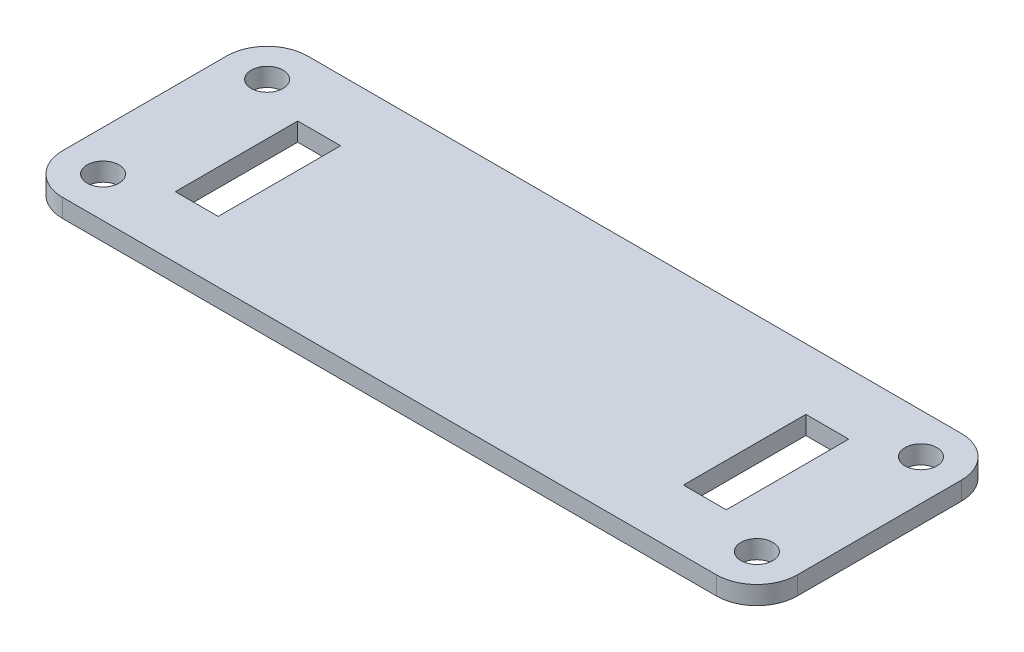
ISO-10303-21;
HEADER;
FILE_DESCRIPTION(('STEP AP214'),'2;1');
FILE_NAME('part.step','',(''),(''),'','','');
FILE_SCHEMA(('AUTOMOTIVE_DESIGN { 1 0 10303 214 1 1 1 1 }'));
ENDSEC;
DATA;
#1=APPLICATION_CONTEXT('core data for automotive mechanical design processes');
#2=APPLICATION_PROTOCOL_DEFINITION('international standard','automotive_design',2000,#1);
#3=PRODUCT_CONTEXT('',#1,'mechanical');
#4=PRODUCT('Part','Part','',(#3));
#5=PRODUCT_RELATED_PRODUCT_CATEGORY('part','',(#4));
#6=PRODUCT_DEFINITION_FORMATION('','',#4);
#7=PRODUCT_DEFINITION_CONTEXT('part definition',#1,'design');
#8=PRODUCT_DEFINITION('design','',#6,#7);
#9=PRODUCT_DEFINITION_SHAPE('','',#8);
#10=(LENGTH_UNIT() NAMED_UNIT(*) SI_UNIT(.MILLI.,.METRE.));
#11=(NAMED_UNIT(*) PLANE_ANGLE_UNIT() SI_UNIT($,.RADIAN.));
#12=(NAMED_UNIT(*) SI_UNIT($,.STERADIAN.) SOLID_ANGLE_UNIT());
#13=UNCERTAINTY_MEASURE_WITH_UNIT(LENGTH_MEASURE(1.E-05),#10,'distance_accuracy_value','');
#14=(GEOMETRIC_REPRESENTATION_CONTEXT(3) GLOBAL_UNCERTAINTY_ASSIGNED_CONTEXT((#13)) GLOBAL_UNIT_ASSIGNED_CONTEXT((#10,
#11,#12)) REPRESENTATION_CONTEXT('',''));
#15=CARTESIAN_POINT('',(0.,0.,0.));
#16=DIRECTION('',(0.,0.,1.));
#17=DIRECTION('',(1.,0.,0.));
#18=AXIS2_PLACEMENT_3D('',#15,#16,#17);
#19=CARTESIAN_POINT('',(-53.4,1.5,-13.4));
#20=DIRECTION('',(0.,1.,0.));
#21=DIRECTION('',(0.,0.,1.));
#22=AXIS2_PLACEMENT_3D('',#19,#20,#21);
#23=PLANE('',#22);
#24=DIRECTION('',(0.,0.,1.));
#25=VECTOR('',#24,1.);
#26=CARTESIAN_POINT('',(-45.,1.5,-10.));
#27=LINE('',#26,#25);
#28=CARTESIAN_POINT('',(-45.,1.5,-10.));
#29=VERTEX_POINT('',#28);
#30=CARTESIAN_POINT('',(-45.,1.5,10.));
#31=VERTEX_POINT('',#30);
#32=EDGE_CURVE('E54',#29,#31,#27,.T.);
#33=ORIENTED_EDGE('',*,*,#32,.F.);
#34=DIRECTION('',(-1.,0.,0.));
#35=VECTOR('',#34,1.);
#36=CARTESIAN_POINT('',(-45.,1.5,-10.));
#37=LINE('',#36,#35);
#38=CARTESIAN_POINT('',(-38.,1.5,-10.));
#39=VERTEX_POINT('',#38);
#40=EDGE_CURVE('E173',#39,#29,#37,.T.);
#41=ORIENTED_EDGE('',*,*,#40,.F.);
#42=DIRECTION('',(0.,0.,-1.));
#43=VECTOR('',#42,1.);
#44=CARTESIAN_POINT('',(-38.,1.5,-10.));
#45=LINE('',#44,#43);
#46=CARTESIAN_POINT('',(-38.,1.5,10.));
#47=VERTEX_POINT('',#46);
#48=EDGE_CURVE('E176',#47,#39,#45,.T.);
#49=ORIENTED_EDGE('',*,*,#48,.F.);
#50=DIRECTION('',(1.,0.,0.));
#51=VECTOR('',#50,1.);
#52=CARTESIAN_POINT('',(-45.,1.5,10.));
#53=LINE('',#52,#51);
#54=EDGE_CURVE('E182',#31,#47,#53,.T.);
#55=ORIENTED_EDGE('',*,*,#54,.F.);
#56=EDGE_LOOP('',(#33,#41,#49,#55));
#57=FACE_BOUND('',#56,.T.);
#58=DIRECTION('',(-1.,0.,0.));
#59=VECTOR('',#58,1.);
#60=CARTESIAN_POINT('',(45.,1.5,-10.));
#61=LINE('',#60,#59);
#62=CARTESIAN_POINT('',(45.,1.5,-10.));
#63=VERTEX_POINT('',#62);
#64=CARTESIAN_POINT('',(38.,1.5,-10.));
#65=VERTEX_POINT('',#64);
#66=EDGE_CURVE('E62',#63,#65,#61,.T.);
#67=ORIENTED_EDGE('',*,*,#66,.F.);
#68=DIRECTION('',(0.,0.,-1.));
#69=VECTOR('',#68,1.);
#70=CARTESIAN_POINT('',(45.,1.5,-10.));
#71=LINE('',#70,#69);
#72=CARTESIAN_POINT('',(45.,1.5,9.99999999999999));
#73=VERTEX_POINT('',#72);
#74=EDGE_CURVE('E201',#73,#63,#71,.T.);
#75=ORIENTED_EDGE('',*,*,#74,.F.);
#76=DIRECTION('',(1.,0.,0.));
#77=VECTOR('',#76,1.);
#78=CARTESIAN_POINT('',(45.,1.5,9.99999999999999));
#79=LINE('',#78,#77);
#80=CARTESIAN_POINT('',(38.,1.5,9.99999999999999));
#81=VERTEX_POINT('',#80);
#82=EDGE_CURVE('E204',#81,#73,#79,.T.);
#83=ORIENTED_EDGE('',*,*,#82,.F.);
#84=DIRECTION('',(0.,0.,1.));
#85=VECTOR('',#84,1.);
#86=CARTESIAN_POINT('',(38.,1.5,-10.));
#87=LINE('',#86,#85);
#88=EDGE_CURVE('E208',#65,#81,#87,.T.);
#89=ORIENTED_EDGE('',*,*,#88,.F.);
#90=EDGE_LOOP('',(#67,#75,#83,#89));
#91=FACE_BOUND('',#90,.T.);
#92=CARTESIAN_POINT('',(53.4,1.5,13.4));
#93=DIRECTION('',(0.,1.,0.));
#94=DIRECTION('',(0.,0.,1.));
#95=AXIS2_PLACEMENT_3D('',#92,#93,#94);
#96=CIRCLE('',#95,2.6);
#97=CARTESIAN_POINT('',(53.4,1.5,16.));
#98=VERTEX_POINT('',#97);
#99=EDGE_CURVE('E228',#98,#98,#96,.T.);
#100=ORIENTED_EDGE('',*,*,#99,.F.);
#101=EDGE_LOOP('',(#100));
#102=FACE_BOUND('',#101,.T.);
#103=CARTESIAN_POINT('',(-53.4,1.5,-13.4));
#104=DIRECTION('',(0.,1.,0.));
#105=DIRECTION('',(0.,0.,1.));
#106=AXIS2_PLACEMENT_3D('',#103,#104,#105);
#107=CIRCLE('',#106,2.6);
#108=CARTESIAN_POINT('',(-53.4,1.5,-10.8));
#109=VERTEX_POINT('',#108);
#110=EDGE_CURVE('E240',#109,#109,#107,.T.);
#111=ORIENTED_EDGE('',*,*,#110,.F.);
#112=EDGE_LOOP('',(#111));
#113=FACE_BOUND('',#112,.T.);
#114=CARTESIAN_POINT('',(-53.4,1.5,-13.4));
#115=DIRECTION('',(0.,1.,0.));
#116=DIRECTION('',(0.,0.,1.));
#117=AXIS2_PLACEMENT_3D('',#114,#115,#116);
#118=CIRCLE('',#117,6.6);
#119=CARTESIAN_POINT('',(-53.4,1.5,-20.));
#120=VERTEX_POINT('',#119);
#121=CARTESIAN_POINT('',(-60.,1.5,-13.4));
#122=VERTEX_POINT('',#121);
#123=EDGE_CURVE('E246',#120,#122,#118,.T.);
#124=ORIENTED_EDGE('',*,*,#123,.T.);
#125=DIRECTION('',(0.,0.,1.));
#126=VECTOR('',#125,1.);
#127=CARTESIAN_POINT('',(-60.,1.5,13.4));
#128=LINE('',#127,#126);
#129=CARTESIAN_POINT('',(-60.,1.5,13.4));
#130=VERTEX_POINT('',#129);
#131=EDGE_CURVE('E249',#122,#130,#128,.T.);
#132=ORIENTED_EDGE('',*,*,#131,.T.);
#133=CARTESIAN_POINT('',(-53.4,1.5,13.4));
#134=DIRECTION('',(0.,1.,0.));
#135=DIRECTION('',(0.,0.,-1.));
#136=AXIS2_PLACEMENT_3D('',#133,#134,#135);
#137=CIRCLE('',#136,6.6);
#138=CARTESIAN_POINT('',(-53.4,1.5,20.));
#139=VERTEX_POINT('',#138);
#140=EDGE_CURVE('E252',#130,#139,#137,.T.);
#141=ORIENTED_EDGE('',*,*,#140,.T.);
#142=DIRECTION('',(1.,0.,0.));
#143=VECTOR('',#142,1.);
#144=CARTESIAN_POINT('',(-53.4,1.5,20.));
#145=LINE('',#144,#143);
#146=CARTESIAN_POINT('',(53.4,1.5,20.));
#147=VERTEX_POINT('',#146);
#148=EDGE_CURVE('E254',#139,#147,#145,.T.);
#149=ORIENTED_EDGE('',*,*,#148,.T.);
#150=CARTESIAN_POINT('',(53.4,1.5,13.4));
#151=DIRECTION('',(0.,1.,0.));
#152=DIRECTION('',(0.,0.,1.));
#153=AXIS2_PLACEMENT_3D('',#150,#151,#152);
#154=CIRCLE('',#153,6.6);
#155=CARTESIAN_POINT('',(60.,1.5,13.4));
#156=VERTEX_POINT('',#155);
#157=EDGE_CURVE('E256',#147,#156,#154,.T.);
#158=ORIENTED_EDGE('',*,*,#157,.T.);
#159=DIRECTION('',(0.,0.,-1.));
#160=VECTOR('',#159,1.);
#161=CARTESIAN_POINT('',(60.,1.5,13.4));
#162=LINE('',#161,#160);
#163=CARTESIAN_POINT('',(60.,1.5,-13.4));
#164=VERTEX_POINT('',#163);
#165=EDGE_CURVE('E258',#156,#164,#162,.T.);
#166=ORIENTED_EDGE('',*,*,#165,.T.);
#167=CARTESIAN_POINT('',(53.4,1.5,-13.4));
#168=DIRECTION('',(0.,1.,0.));
#169=DIRECTION('',(0.,0.,-1.));
#170=AXIS2_PLACEMENT_3D('',#167,#168,#169);
#171=CIRCLE('',#170,6.6);
#172=CARTESIAN_POINT('',(53.4,1.5,-20.));
#173=VERTEX_POINT('',#172);
#174=EDGE_CURVE('E260',#164,#173,#171,.T.);
#175=ORIENTED_EDGE('',*,*,#174,.T.);
#176=DIRECTION('',(-1.,0.,0.));
#177=VECTOR('',#176,1.);
#178=CARTESIAN_POINT('',(-53.4,1.5,-20.));
#179=LINE('',#178,#177);
#180=EDGE_CURVE('E262',#173,#120,#179,.T.);
#181=ORIENTED_EDGE('',*,*,#180,.T.);
#182=EDGE_LOOP('',(#124,#132,#141,#149,#158,#166,#175,#181));
#183=FACE_BOUND('',#182,.T.);
#184=CARTESIAN_POINT('',(53.4,1.5,-13.4));
#185=DIRECTION('',(0.,1.,0.));
#186=DIRECTION('',(0.,0.,-1.));
#187=AXIS2_PLACEMENT_3D('',#184,#185,#186);
#188=CIRCLE('',#187,2.6);
#189=CARTESIAN_POINT('',(53.4,1.5,-16.));
#190=VERTEX_POINT('',#189);
#191=EDGE_CURVE('E234',#190,#190,#188,.T.);
#192=ORIENTED_EDGE('',*,*,#191,.F.);
#193=EDGE_LOOP('',(#192));
#194=FACE_BOUND('',#193,.T.);
#195=CARTESIAN_POINT('',(-53.4,1.5,13.4));
#196=DIRECTION('',(0.,1.,0.));
#197=DIRECTION('',(0.,0.,-1.));
#198=AXIS2_PLACEMENT_3D('',#195,#196,#197);
#199=CIRCLE('',#198,2.6);
#200=CARTESIAN_POINT('',(-53.4,1.5,10.8));
#201=VERTEX_POINT('',#200);
#202=EDGE_CURVE('E222',#201,#201,#199,.T.);
#203=ORIENTED_EDGE('',*,*,#202,.F.);
#204=EDGE_LOOP('',(#203));
#205=FACE_BOUND('',#204,.T.);
#206=ADVANCED_FACE('F39',(#57,#91,#102,#113,#183,#194,#205),#23,.T.);
#207=CARTESIAN_POINT('',(-53.4,-1.5,-13.4));
#208=DIRECTION('',(0.,1.,0.));
#209=DIRECTION('',(0.,0.,1.));
#210=AXIS2_PLACEMENT_3D('',#207,#208,#209);
#211=PLANE('',#210);
#212=DIRECTION('',(-1.,0.,0.));
#213=VECTOR('',#212,1.);
#214=CARTESIAN_POINT('',(-45.,-1.5,-10.));
#215=LINE('',#214,#213);
#216=CARTESIAN_POINT('',(-38.,-1.5,-10.));
#217=VERTEX_POINT('',#216);
#218=CARTESIAN_POINT('',(-45.,-1.5,-10.));
#219=VERTEX_POINT('',#218);
#220=EDGE_CURVE('E160',#217,#219,#215,.T.);
#221=ORIENTED_EDGE('',*,*,#220,.T.);
#222=DIRECTION('',(0.,0.,1.));
#223=VECTOR('',#222,1.);
#224=CARTESIAN_POINT('',(-45.,-1.5,-10.));
#225=LINE('',#224,#223);
#226=CARTESIAN_POINT('',(-45.,-1.5,10.));
#227=VERTEX_POINT('',#226);
#228=EDGE_CURVE('E154',#219,#227,#225,.T.);
#229=ORIENTED_EDGE('',*,*,#228,.T.);
#230=DIRECTION('',(1.,0.,0.));
#231=VECTOR('',#230,1.);
#232=CARTESIAN_POINT('',(-45.,-1.5,10.));
#233=LINE('',#232,#231);
#234=CARTESIAN_POINT('',(-38.,-1.5,10.));
#235=VERTEX_POINT('',#234);
#236=EDGE_CURVE('E164',#227,#235,#233,.T.);
#237=ORIENTED_EDGE('',*,*,#236,.T.);
#238=DIRECTION('',(0.,0.,-1.));
#239=VECTOR('',#238,1.);
#240=CARTESIAN_POINT('',(-38.,-1.5,-10.));
#241=LINE('',#240,#239);
#242=EDGE_CURVE('E168',#235,#217,#241,.T.);
#243=ORIENTED_EDGE('',*,*,#242,.T.);
#244=EDGE_LOOP('',(#221,#229,#237,#243));
#245=FACE_BOUND('',#244,.T.);
#246=DIRECTION('',(0.,0.,-1.));
#247=VECTOR('',#246,1.);
#248=CARTESIAN_POINT('',(45.,-1.5,-10.));
#249=LINE('',#248,#247);
#250=CARTESIAN_POINT('',(45.,-1.5,9.99999999999999));
#251=VERTEX_POINT('',#250);
#252=CARTESIAN_POINT('',(45.,-1.5,-10.));
#253=VERTEX_POINT('',#252);
#254=EDGE_CURVE('E194',#251,#253,#249,.T.);
#255=ORIENTED_EDGE('',*,*,#254,.T.);
#256=DIRECTION('',(-1.,0.,0.));
#257=VECTOR('',#256,1.);
#258=CARTESIAN_POINT('',(45.,-1.5,-10.));
#259=LINE('',#258,#257);
#260=CARTESIAN_POINT('',(38.,-1.5,-10.));
#261=VERTEX_POINT('',#260);
#262=EDGE_CURVE('E205',#253,#261,#259,.T.);
#263=ORIENTED_EDGE('',*,*,#262,.T.);
#264=DIRECTION('',(0.,0.,1.));
#265=VECTOR('',#264,1.);
#266=CARTESIAN_POINT('',(38.,-1.5,-10.));
#267=LINE('',#266,#265);
#268=CARTESIAN_POINT('',(38.,-1.5,9.99999999999999));
#269=VERTEX_POINT('',#268);
#270=EDGE_CURVE('E217',#261,#269,#267,.T.);
#271=ORIENTED_EDGE('',*,*,#270,.T.);
#272=DIRECTION('',(1.,0.,0.));
#273=VECTOR('',#272,1.);
#274=CARTESIAN_POINT('',(45.,-1.5,9.99999999999999));
#275=LINE('',#274,#273);
#276=EDGE_CURVE('E214',#269,#251,#275,.T.);
#277=ORIENTED_EDGE('',*,*,#276,.T.);
#278=EDGE_LOOP('',(#255,#263,#271,#277));
#279=FACE_BOUND('',#278,.T.);
#280=CARTESIAN_POINT('',(-53.4,-1.5,-13.4));
#281=DIRECTION('',(0.,1.,0.));
#282=DIRECTION('',(0.,0.,1.));
#283=AXIS2_PLACEMENT_3D('',#280,#281,#282);
#284=CIRCLE('',#283,6.6);
#285=CARTESIAN_POINT('',(-53.4,-1.5,-20.));
#286=VERTEX_POINT('',#285);
#287=CARTESIAN_POINT('',(-60.,-1.5,-13.4));
#288=VERTEX_POINT('',#287);
#289=EDGE_CURVE('E243',#286,#288,#284,.T.);
#290=ORIENTED_EDGE('',*,*,#289,.F.);
#291=DIRECTION('',(-1.,0.,0.));
#292=VECTOR('',#291,1.);
#293=CARTESIAN_POINT('',(-53.4,-1.5,-20.));
#294=LINE('',#293,#292);
#295=CARTESIAN_POINT('',(53.4,-1.5,-20.));
#296=VERTEX_POINT('',#295);
#297=EDGE_CURVE('E250',#296,#286,#294,.T.);
#298=ORIENTED_EDGE('',*,*,#297,.F.);
#299=CARTESIAN_POINT('',(53.4,-1.5,-13.4));
#300=DIRECTION('',(0.,1.,0.));
#301=DIRECTION('',(0.,0.,-1.));
#302=AXIS2_PLACEMENT_3D('',#299,#300,#301);
#303=CIRCLE('',#302,6.6);
#304=CARTESIAN_POINT('',(60.,-1.5,-13.4));
#305=VERTEX_POINT('',#304);
#306=EDGE_CURVE('E277',#305,#296,#303,.T.);
#307=ORIENTED_EDGE('',*,*,#306,.F.);
#308=DIRECTION('',(0.,0.,-1.));
#309=VECTOR('',#308,1.);
#310=CARTESIAN_POINT('',(60.,-1.5,13.4));
#311=LINE('',#310,#309);
#312=CARTESIAN_POINT('',(60.,-1.5,13.4));
#313=VERTEX_POINT('',#312);
#314=EDGE_CURVE('E275',#313,#305,#311,.T.);
#315=ORIENTED_EDGE('',*,*,#314,.F.);
#316=CARTESIAN_POINT('',(53.4,-1.5,13.4));
#317=DIRECTION('',(0.,1.,0.));
#318=DIRECTION('',(0.,0.,1.));
#319=AXIS2_PLACEMENT_3D('',#316,#317,#318);
#320=CIRCLE('',#319,6.6);
#321=CARTESIAN_POINT('',(53.4,-1.5,20.));
#322=VERTEX_POINT('',#321);
#323=EDGE_CURVE('E273',#322,#313,#320,.T.);
#324=ORIENTED_EDGE('',*,*,#323,.F.);
#325=DIRECTION('',(1.,0.,0.));
#326=VECTOR('',#325,1.);
#327=CARTESIAN_POINT('',(-53.4,-1.5,20.));
#328=LINE('',#327,#326);
#329=CARTESIAN_POINT('',(-53.4,-1.5,20.));
#330=VERTEX_POINT('',#329);
#331=EDGE_CURVE('E271',#330,#322,#328,.T.);
#332=ORIENTED_EDGE('',*,*,#331,.F.);
#333=CARTESIAN_POINT('',(-53.4,-1.5,13.4));
#334=DIRECTION('',(0.,1.,0.));
#335=DIRECTION('',(0.,0.,-1.));
#336=AXIS2_PLACEMENT_3D('',#333,#334,#335);
#337=CIRCLE('',#336,6.6);
#338=CARTESIAN_POINT('',(-60.,-1.5,13.4));
#339=VERTEX_POINT('',#338);
#340=EDGE_CURVE('E269',#339,#330,#337,.T.);
#341=ORIENTED_EDGE('',*,*,#340,.F.);
#342=DIRECTION('',(0.,0.,1.));
#343=VECTOR('',#342,1.);
#344=CARTESIAN_POINT('',(-60.,-1.5,13.4));
#345=LINE('',#344,#343);
#346=EDGE_CURVE('E267',#288,#339,#345,.T.);
#347=ORIENTED_EDGE('',*,*,#346,.F.);
#348=EDGE_LOOP('',(#290,#298,#307,#315,#324,#332,#341,#347));
#349=FACE_BOUND('',#348,.T.);
#350=CARTESIAN_POINT('',(-53.4,-1.5,-13.4));
#351=DIRECTION('',(0.,1.,0.));
#352=DIRECTION('',(0.,0.,1.));
#353=AXIS2_PLACEMENT_3D('',#350,#351,#352);
#354=CIRCLE('',#353,2.6);
#355=CARTESIAN_POINT('',(-53.4,-1.5,-10.8));
#356=VERTEX_POINT('',#355);
#357=EDGE_CURVE('E237',#356,#356,#354,.T.);
#358=ORIENTED_EDGE('',*,*,#357,.T.);
#359=EDGE_LOOP('',(#358));
#360=FACE_BOUND('',#359,.T.);
#361=CARTESIAN_POINT('',(53.4,-1.5,-13.4));
#362=DIRECTION('',(0.,1.,0.));
#363=DIRECTION('',(0.,0.,-1.));
#364=AXIS2_PLACEMENT_3D('',#361,#362,#363);
#365=CIRCLE('',#364,2.6);
#366=CARTESIAN_POINT('',(53.4,-1.5,-16.));
#367=VERTEX_POINT('',#366);
#368=EDGE_CURVE('E231',#367,#367,#365,.T.);
#369=ORIENTED_EDGE('',*,*,#368,.T.);
#370=EDGE_LOOP('',(#369));
#371=FACE_BOUND('',#370,.T.);
#372=CARTESIAN_POINT('',(53.4,-1.5,13.4));
#373=DIRECTION('',(0.,1.,0.));
#374=DIRECTION('',(0.,0.,1.));
#375=AXIS2_PLACEMENT_3D('',#372,#373,#374);
#376=CIRCLE('',#375,2.6);
#377=CARTESIAN_POINT('',(53.4,-1.5,16.));
#378=VERTEX_POINT('',#377);
#379=EDGE_CURVE('E225',#378,#378,#376,.T.);
#380=ORIENTED_EDGE('',*,*,#379,.T.);
#381=EDGE_LOOP('',(#380));
#382=FACE_BOUND('',#381,.T.);
#383=CARTESIAN_POINT('',(-53.4,-1.5,13.4));
#384=DIRECTION('',(0.,1.,0.));
#385=DIRECTION('',(0.,0.,-1.));
#386=AXIS2_PLACEMENT_3D('',#383,#384,#385);
#387=CIRCLE('',#386,2.6);
#388=CARTESIAN_POINT('',(-53.4,-1.5,10.8));
#389=VERTEX_POINT('',#388);
#390=EDGE_CURVE('E188',#389,#389,#387,.T.);
#391=ORIENTED_EDGE('',*,*,#390,.T.);
#392=EDGE_LOOP('',(#391));
#393=FACE_BOUND('',#392,.T.);
#394=ADVANCED_FACE('F170',(#245,#279,#349,#360,#371,#382,#393),#211,.F.);
#395=CARTESIAN_POINT('',(-53.4,1.5,-13.4));
#396=DIRECTION('',(0.,-1.,0.));
#397=DIRECTION('',(0.,0.,-1.));
#398=AXIS2_PLACEMENT_3D('',#395,#396,#397);
#399=CYLINDRICAL_SURFACE('',#398,6.6);
#400=ORIENTED_EDGE('',*,*,#289,.T.);
#401=DIRECTION('',(0.,-1.,0.));
#402=VECTOR('',#401,1.);
#403=CARTESIAN_POINT('',(-60.,1.5,-13.4));
#404=LINE('',#403,#402);
#405=EDGE_CURVE('E11',#122,#288,#404,.T.);
#406=ORIENTED_EDGE('',*,*,#405,.F.);
#407=ORIENTED_EDGE('',*,*,#123,.F.);
#408=DIRECTION('',(0.,-1.,0.));
#409=VECTOR('',#408,1.);
#410=CARTESIAN_POINT('',(-53.4,1.5,-20.));
#411=LINE('',#410,#409);
#412=EDGE_CURVE('E264',#120,#286,#411,.T.);
#413=ORIENTED_EDGE('',*,*,#412,.T.);
#414=EDGE_LOOP('',(#400,#406,#407,#413));
#415=FACE_BOUND('',#414,.T.);
#416=ADVANCED_FACE('F41',(#415),#399,.T.);
#417=CARTESIAN_POINT('',(-60.,1.5,13.4));
#418=DIRECTION('',(1.,0.,0.));
#419=DIRECTION('',(0.,0.,-1.));
#420=AXIS2_PLACEMENT_3D('',#417,#418,#419);
#421=PLANE('',#420);
#422=ORIENTED_EDGE('',*,*,#346,.T.);
#423=DIRECTION('',(0.,-1.,0.));
#424=VECTOR('',#423,1.);
#425=CARTESIAN_POINT('',(-60.,1.5,13.4));
#426=LINE('',#425,#424);
#427=EDGE_CURVE('E47',#130,#339,#426,.T.);
#428=ORIENTED_EDGE('',*,*,#427,.F.);
#429=ORIENTED_EDGE('',*,*,#131,.F.);
#430=ORIENTED_EDGE('',*,*,#405,.T.);
#431=EDGE_LOOP('',(#422,#428,#429,#430));
#432=FACE_BOUND('',#431,.T.);
#433=ADVANCED_FACE('F324',(#432),#421,.F.);
#434=CARTESIAN_POINT('',(-53.4,1.5,13.4));
#435=DIRECTION('',(0.,-1.,0.));
#436=DIRECTION('',(0.,0.,-1.));
#437=AXIS2_PLACEMENT_3D('',#434,#435,#436);
#438=CYLINDRICAL_SURFACE('',#437,6.6);
#439=ORIENTED_EDGE('',*,*,#340,.T.);
#440=DIRECTION('',(0.,-1.,0.));
#441=VECTOR('',#440,1.);
#442=CARTESIAN_POINT('',(-53.4,1.5,20.));
#443=LINE('',#442,#441);
#444=EDGE_CURVE('E294',#139,#330,#443,.T.);
#445=ORIENTED_EDGE('',*,*,#444,.F.);
#446=ORIENTED_EDGE('',*,*,#140,.F.);
#447=ORIENTED_EDGE('',*,*,#427,.T.);
#448=EDGE_LOOP('',(#439,#445,#446,#447));
#449=FACE_BOUND('',#448,.T.);
#450=ADVANCED_FACE('F301',(#449),#438,.T.);
#451=CARTESIAN_POINT('',(-53.4,1.5,20.));
#452=DIRECTION('',(0.,0.,-1.));
#453=DIRECTION('',(-1.,0.,0.));
#454=AXIS2_PLACEMENT_3D('',#451,#452,#453);
#455=PLANE('',#454);
#456=ORIENTED_EDGE('',*,*,#331,.T.);
#457=DIRECTION('',(0.,-1.,0.));
#458=VECTOR('',#457,1.);
#459=CARTESIAN_POINT('',(53.4,1.5,20.));
#460=LINE('',#459,#458);
#461=EDGE_CURVE('E291',#147,#322,#460,.T.);
#462=ORIENTED_EDGE('',*,*,#461,.F.);
#463=ORIENTED_EDGE('',*,*,#148,.F.);
#464=ORIENTED_EDGE('',*,*,#444,.T.);
#465=EDGE_LOOP('',(#456,#462,#463,#464));
#466=FACE_BOUND('',#465,.T.);
#467=ADVANCED_FACE('F312',(#466),#455,.F.);
#468=CARTESIAN_POINT('',(53.4,1.5,13.4));
#469=DIRECTION('',(0.,-1.,0.));
#470=DIRECTION('',(0.,0.,-1.));
#471=AXIS2_PLACEMENT_3D('',#468,#469,#470);
#472=CYLINDRICAL_SURFACE('',#471,6.6);
#473=ORIENTED_EDGE('',*,*,#323,.T.);
#474=DIRECTION('',(0.,-1.,0.));
#475=VECTOR('',#474,1.);
#476=CARTESIAN_POINT('',(60.,1.5,13.4));
#477=LINE('',#476,#475);
#478=EDGE_CURVE('E288',#156,#313,#477,.T.);
#479=ORIENTED_EDGE('',*,*,#478,.F.);
#480=ORIENTED_EDGE('',*,*,#157,.F.);
#481=ORIENTED_EDGE('',*,*,#461,.T.);
#482=EDGE_LOOP('',(#473,#479,#480,#481));
#483=FACE_BOUND('',#482,.T.);
#484=ADVANCED_FACE('F316',(#483),#472,.T.);
#485=CARTESIAN_POINT('',(60.,1.5,13.4));
#486=DIRECTION('',(-1.,0.,0.));
#487=DIRECTION('',(0.,0.,1.));
#488=AXIS2_PLACEMENT_3D('',#485,#486,#487);
#489=PLANE('',#488);
#490=ORIENTED_EDGE('',*,*,#314,.T.);
#491=DIRECTION('',(0.,-1.,0.));
#492=VECTOR('',#491,1.);
#493=CARTESIAN_POINT('',(60.,1.5,-13.4));
#494=LINE('',#493,#492);
#495=EDGE_CURVE('E285',#164,#305,#494,.T.);
#496=ORIENTED_EDGE('',*,*,#495,.F.);
#497=ORIENTED_EDGE('',*,*,#165,.F.);
#498=ORIENTED_EDGE('',*,*,#478,.T.);
#499=EDGE_LOOP('',(#490,#496,#497,#498));
#500=FACE_BOUND('',#499,.T.);
#501=ADVANCED_FACE('F337',(#500),#489,.F.);
#502=CARTESIAN_POINT('',(53.4,1.5,-13.4));
#503=DIRECTION('',(0.,-1.,0.));
#504=DIRECTION('',(0.,0.,-1.));
#505=AXIS2_PLACEMENT_3D('',#502,#503,#504);
#506=CYLINDRICAL_SURFACE('',#505,6.6);
#507=ORIENTED_EDGE('',*,*,#306,.T.);
#508=DIRECTION('',(0.,-1.,0.));
#509=VECTOR('',#508,1.);
#510=CARTESIAN_POINT('',(53.4,1.5,-20.));
#511=LINE('',#510,#509);
#512=EDGE_CURVE('E282',#173,#296,#511,.T.);
#513=ORIENTED_EDGE('',*,*,#512,.F.);
#514=ORIENTED_EDGE('',*,*,#174,.F.);
#515=ORIENTED_EDGE('',*,*,#495,.T.);
#516=EDGE_LOOP('',(#507,#513,#514,#515));
#517=FACE_BOUND('',#516,.T.);
#518=ADVANCED_FACE('F335',(#517),#506,.T.);
#519=CARTESIAN_POINT('',(-53.4,1.5,-20.));
#520=DIRECTION('',(0.,0.,1.));
#521=DIRECTION('',(1.,0.,0.));
#522=AXIS2_PLACEMENT_3D('',#519,#520,#521);
#523=PLANE('',#522);
#524=ORIENTED_EDGE('',*,*,#297,.T.);
#525=ORIENTED_EDGE('',*,*,#412,.F.);
#526=ORIENTED_EDGE('',*,*,#180,.F.);
#527=ORIENTED_EDGE('',*,*,#512,.T.);
#528=EDGE_LOOP('',(#524,#525,#526,#527));
#529=FACE_BOUND('',#528,.T.);
#530=ADVANCED_FACE('F330',(#529),#523,.F.);
#531=CARTESIAN_POINT('',(-53.4,1.5,-13.4));
#532=DIRECTION('',(0.,-1.,0.));
#533=DIRECTION('',(0.,0.,-1.));
#534=AXIS2_PLACEMENT_3D('',#531,#532,#533);
#535=CYLINDRICAL_SURFACE('',#534,2.6);
#536=ORIENTED_EDGE('',*,*,#110,.T.);
#537=EDGE_LOOP('',(#536));
#538=FACE_BOUND('',#537,.T.);
#539=ORIENTED_EDGE('',*,*,#357,.F.);
#540=EDGE_LOOP('',(#539));
#541=FACE_BOUND('',#540,.T.);
#542=ADVANCED_FACE('F356',(#538,#541),#535,.F.);
#543=CARTESIAN_POINT('',(53.4,1.5,-13.4));
#544=DIRECTION('',(0.,-1.,0.));
#545=DIRECTION('',(0.,0.,-1.));
#546=AXIS2_PLACEMENT_3D('',#543,#544,#545);
#547=CYLINDRICAL_SURFACE('',#546,2.6);
#548=ORIENTED_EDGE('',*,*,#191,.T.);
#549=EDGE_LOOP('',(#548));
#550=FACE_BOUND('',#549,.T.);
#551=ORIENTED_EDGE('',*,*,#368,.F.);
#552=EDGE_LOOP('',(#551));
#553=FACE_BOUND('',#552,.T.);
#554=ADVANCED_FACE('F363',(#550,#553),#547,.F.);
#555=CARTESIAN_POINT('',(53.4,1.5,13.4));
#556=DIRECTION('',(0.,-1.,0.));
#557=DIRECTION('',(0.,0.,-1.));
#558=AXIS2_PLACEMENT_3D('',#555,#556,#557);
#559=CYLINDRICAL_SURFACE('',#558,2.6);
#560=ORIENTED_EDGE('',*,*,#99,.T.);
#561=EDGE_LOOP('',(#560));
#562=FACE_BOUND('',#561,.T.);
#563=ORIENTED_EDGE('',*,*,#379,.F.);
#564=EDGE_LOOP('',(#563));
#565=FACE_BOUND('',#564,.T.);
#566=ADVANCED_FACE('F368',(#562,#565),#559,.F.);
#567=CARTESIAN_POINT('',(-53.4,1.5,13.4));
#568=DIRECTION('',(0.,-1.,0.));
#569=DIRECTION('',(0.,0.,-1.));
#570=AXIS2_PLACEMENT_3D('',#567,#568,#569);
#571=CYLINDRICAL_SURFACE('',#570,2.6);
#572=ORIENTED_EDGE('',*,*,#202,.T.);
#573=EDGE_LOOP('',(#572));
#574=FACE_BOUND('',#573,.T.);
#575=ORIENTED_EDGE('',*,*,#390,.F.);
#576=EDGE_LOOP('',(#575));
#577=FACE_BOUND('',#576,.T.);
#578=ADVANCED_FACE('F380',(#574,#577),#571,.F.);
#579=CARTESIAN_POINT('',(45.,-1.5,-10.));
#580=DIRECTION('',(0.,0.,-1.));
#581=DIRECTION('',(-1.,0.,0.));
#582=AXIS2_PLACEMENT_3D('',#579,#580,#581);
#583=PLANE('',#582);
#584=ORIENTED_EDGE('',*,*,#66,.T.);
#585=DIRECTION('',(0.,1.,0.));
#586=VECTOR('',#585,1.);
#587=CARTESIAN_POINT('',(38.,-1.5,-10.));
#588=LINE('',#587,#586);
#589=EDGE_CURVE('E192',#261,#65,#588,.T.);
#590=ORIENTED_EDGE('',*,*,#589,.F.);
#591=ORIENTED_EDGE('',*,*,#262,.F.);
#592=DIRECTION('',(0.,1.,0.));
#593=VECTOR('',#592,1.);
#594=CARTESIAN_POINT('',(45.,-1.5,-10.));
#595=LINE('',#594,#593);
#596=EDGE_CURVE('E199',#253,#63,#595,.T.);
#597=ORIENTED_EDGE('',*,*,#596,.T.);
#598=EDGE_LOOP('',(#584,#590,#591,#597));
#599=FACE_BOUND('',#598,.T.);
#600=ADVANCED_FACE('F381',(#599),#583,.F.);
#601=CARTESIAN_POINT('',(45.,-1.5,-10.));
#602=DIRECTION('',(1.,0.,0.));
#603=DIRECTION('',(0.,0.,-1.));
#604=AXIS2_PLACEMENT_3D('',#601,#602,#603);
#605=PLANE('',#604);
#606=ORIENTED_EDGE('',*,*,#74,.T.);
#607=ORIENTED_EDGE('',*,*,#596,.F.);
#608=ORIENTED_EDGE('',*,*,#254,.F.);
#609=DIRECTION('',(0.,1.,0.));
#610=VECTOR('',#609,1.);
#611=CARTESIAN_POINT('',(45.,-1.5,9.99999999999999));
#612=LINE('',#611,#610);
#613=EDGE_CURVE('E197',#251,#73,#612,.T.);
#614=ORIENTED_EDGE('',*,*,#613,.T.);
#615=EDGE_LOOP('',(#606,#607,#608,#614));
#616=FACE_BOUND('',#615,.T.);
#617=ADVANCED_FACE('F388',(#616),#605,.F.);
#618=CARTESIAN_POINT('',(45.,-1.5,9.99999999999999));
#619=DIRECTION('',(0.,0.,1.));
#620=DIRECTION('',(1.,0.,0.));
#621=AXIS2_PLACEMENT_3D('',#618,#619,#620);
#622=PLANE('',#621);
#623=ORIENTED_EDGE('',*,*,#82,.T.);
#624=ORIENTED_EDGE('',*,*,#613,.F.);
#625=ORIENTED_EDGE('',*,*,#276,.F.);
#626=DIRECTION('',(0.,1.,0.));
#627=VECTOR('',#626,1.);
#628=CARTESIAN_POINT('',(38.,-1.5,9.99999999999999));
#629=LINE('',#628,#627);
#630=EDGE_CURVE('E195',#269,#81,#629,.T.);
#631=ORIENTED_EDGE('',*,*,#630,.T.);
#632=EDGE_LOOP('',(#623,#624,#625,#631));
#633=FACE_BOUND('',#632,.T.);
#634=ADVANCED_FACE('F395',(#633),#622,.F.);
#635=CARTESIAN_POINT('',(38.,-1.5,-10.));
#636=DIRECTION('',(-1.,0.,0.));
#637=DIRECTION('',(0.,0.,1.));
#638=AXIS2_PLACEMENT_3D('',#635,#636,#637);
#639=PLANE('',#638);
#640=ORIENTED_EDGE('',*,*,#88,.T.);
#641=ORIENTED_EDGE('',*,*,#630,.F.);
#642=ORIENTED_EDGE('',*,*,#270,.F.);
#643=ORIENTED_EDGE('',*,*,#589,.T.);
#644=EDGE_LOOP('',(#640,#641,#642,#643));
#645=FACE_BOUND('',#644,.T.);
#646=ADVANCED_FACE('F399',(#645),#639,.F.);
#647=CARTESIAN_POINT('',(-45.,-1.5,-10.));
#648=DIRECTION('',(-1.,0.,0.));
#649=DIRECTION('',(0.,0.,1.));
#650=AXIS2_PLACEMENT_3D('',#647,#648,#649);
#651=PLANE('',#650);
#652=ORIENTED_EDGE('',*,*,#32,.T.);
#653=DIRECTION('',(0.,1.,0.));
#654=VECTOR('',#653,1.);
#655=CARTESIAN_POINT('',(-45.,-1.5,10.));
#656=LINE('',#655,#654);
#657=EDGE_CURVE('E150',#227,#31,#656,.T.);
#658=ORIENTED_EDGE('',*,*,#657,.F.);
#659=ORIENTED_EDGE('',*,*,#228,.F.);
#660=DIRECTION('',(0.,1.,0.));
#661=VECTOR('',#660,1.);
#662=CARTESIAN_POINT('',(-45.,-1.5,-10.));
#663=LINE('',#662,#661);
#664=EDGE_CURVE('E186',#219,#29,#663,.T.);
#665=ORIENTED_EDGE('',*,*,#664,.T.);
#666=EDGE_LOOP('',(#652,#658,#659,#665));
#667=FACE_BOUND('',#666,.T.);
#668=ADVANCED_FACE('F152',(#667),#651,.F.);
#669=CARTESIAN_POINT('',(-45.,-1.5,-10.));
#670=DIRECTION('',(0.,0.,-1.));
#671=DIRECTION('',(-1.,0.,0.));
#672=AXIS2_PLACEMENT_3D('',#669,#670,#671);
#673=PLANE('',#672);
#674=ORIENTED_EDGE('',*,*,#40,.T.);
#675=ORIENTED_EDGE('',*,*,#664,.F.);
#676=ORIENTED_EDGE('',*,*,#220,.F.);
#677=DIRECTION('',(0.,1.,0.));
#678=VECTOR('',#677,1.);
#679=CARTESIAN_POINT('',(-38.,-1.5,-10.));
#680=LINE('',#679,#678);
#681=EDGE_CURVE('E189',#217,#39,#680,.T.);
#682=ORIENTED_EDGE('',*,*,#681,.T.);
#683=EDGE_LOOP('',(#674,#675,#676,#682));
#684=FACE_BOUND('',#683,.T.);
#685=ADVANCED_FACE('F406',(#684),#673,.F.);
#686=CARTESIAN_POINT('',(-38.,-1.5,-10.));
#687=DIRECTION('',(1.,0.,0.));
#688=DIRECTION('',(0.,0.,-1.));
#689=AXIS2_PLACEMENT_3D('',#686,#687,#688);
#690=PLANE('',#689);
#691=ORIENTED_EDGE('',*,*,#48,.T.);
#692=ORIENTED_EDGE('',*,*,#681,.F.);
#693=ORIENTED_EDGE('',*,*,#242,.F.);
#694=DIRECTION('',(0.,1.,0.));
#695=VECTOR('',#694,1.);
#696=CARTESIAN_POINT('',(-38.,-1.5,10.));
#697=LINE('',#696,#695);
#698=EDGE_CURVE('E159',#235,#47,#697,.T.);
#699=ORIENTED_EDGE('',*,*,#698,.T.);
#700=EDGE_LOOP('',(#691,#692,#693,#699));
#701=FACE_BOUND('',#700,.T.);
#702=ADVANCED_FACE('F409',(#701),#690,.F.);
#703=CARTESIAN_POINT('',(-45.,-1.5,10.));
#704=DIRECTION('',(0.,0.,1.));
#705=DIRECTION('',(1.,0.,0.));
#706=AXIS2_PLACEMENT_3D('',#703,#704,#705);
#707=PLANE('',#706);
#708=ORIENTED_EDGE('',*,*,#54,.T.);
#709=ORIENTED_EDGE('',*,*,#698,.F.);
#710=ORIENTED_EDGE('',*,*,#236,.F.);
#711=ORIENTED_EDGE('',*,*,#657,.T.);
#712=EDGE_LOOP('',(#708,#709,#710,#711));
#713=FACE_BOUND('',#712,.T.);
#714=ADVANCED_FACE('F165',(#713),#707,.F.);
#715=CLOSED_SHELL('',(#206,#394,#416,#433,#450,#467,#484,#501,#518,#530,#542,#554,#566,#578,
#600,#617,#634,#646,#668,#685,#702,#714));
#716=MANIFOLD_SOLID_BREP('B2',#715);
#717=ADVANCED_BREP_SHAPE_REPRESENTATION('',(#18,#716),#14);
#718=SHAPE_DEFINITION_REPRESENTATION(#9,#717);
ENDSEC;
END-ISO-10303-21;
